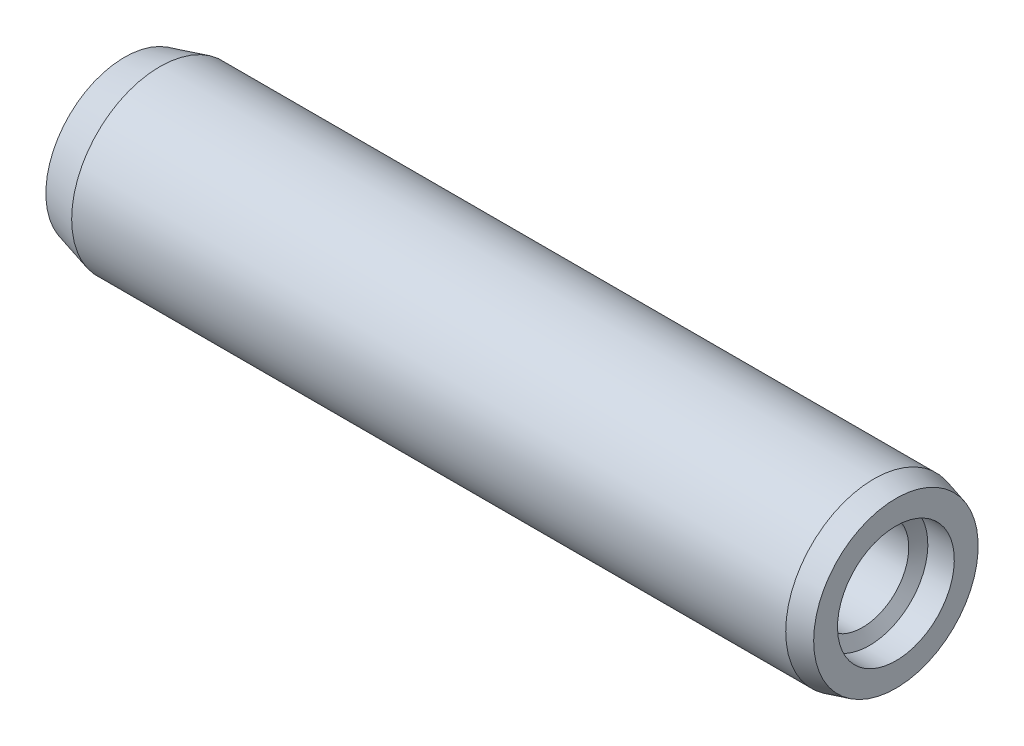
ISO-10303-21;
HEADER;
FILE_DESCRIPTION(('STEP AP214'),'2;1');
FILE_NAME('part.step','',(''),(''),'','','');
FILE_SCHEMA(('AUTOMOTIVE_DESIGN { 1 0 10303 214 1 1 1 1 }'));
ENDSEC;
DATA;
#1=APPLICATION_CONTEXT('core data for automotive mechanical design processes');
#2=APPLICATION_PROTOCOL_DEFINITION('international standard','automotive_design',2000,#1);
#3=PRODUCT_CONTEXT('',#1,'mechanical');
#4=PRODUCT('Part','Part','',(#3));
#5=PRODUCT_RELATED_PRODUCT_CATEGORY('part','',(#4));
#6=PRODUCT_DEFINITION_FORMATION('','',#4);
#7=PRODUCT_DEFINITION_CONTEXT('part definition',#1,'design');
#8=PRODUCT_DEFINITION('design','',#6,#7);
#9=PRODUCT_DEFINITION_SHAPE('','',#8);
#10=(LENGTH_UNIT() NAMED_UNIT(*) SI_UNIT(.MILLI.,.METRE.));
#11=(NAMED_UNIT(*) PLANE_ANGLE_UNIT() SI_UNIT($,.RADIAN.));
#12=(NAMED_UNIT(*) SI_UNIT($,.STERADIAN.) SOLID_ANGLE_UNIT());
#13=UNCERTAINTY_MEASURE_WITH_UNIT(LENGTH_MEASURE(1.E-05),#10,'distance_accuracy_value','');
#14=(GEOMETRIC_REPRESENTATION_CONTEXT(3) GLOBAL_UNCERTAINTY_ASSIGNED_CONTEXT((#13)) GLOBAL_UNIT_ASSIGNED_CONTEXT((#10,
#11,#12)) REPRESENTATION_CONTEXT('',''));
#15=CARTESIAN_POINT('',(0.,0.,0.));
#16=DIRECTION('',(0.,0.,1.));
#17=DIRECTION('',(1.,0.,0.));
#18=AXIS2_PLACEMENT_3D('',#15,#16,#17);
#19=CARTESIAN_POINT('',(23.0000000000814,0.,0.));
#20=DIRECTION('',(1.,0.,0.));
#21=DIRECTION('',(0.,0.,-1.));
#22=AXIS2_PLACEMENT_3D('',#19,#20,#21);
#23=CONICAL_SURFACE('',#22,2.09999999998445,1.04719755120229);
#24=CARTESIAN_POINT('',(21.7875644348169,0.,0.));
#25=VERTEX_POINT('',#24);
#26=VERTEX_LOOP('',#25);
#27=FACE_BOUND('',#26,.T.);
#28=CARTESIAN_POINT('',(23.,0.,0.));
#29=DIRECTION('',(1.,0.,0.));
#30=DIRECTION('',(0.,1.,0.));
#31=AXIS2_PLACEMENT_3D('',#28,#29,#30);
#32=CIRCLE('',#31,2.1);
#33=CARTESIAN_POINT('',(23.,2.1,0.));
#34=VERTEX_POINT('',#33);
#35=EDGE_CURVE('E34',#34,#34,#32,.T.);
#36=ORIENTED_EDGE('',*,*,#35,.T.);
#37=EDGE_LOOP('',(#36));
#38=FACE_BOUND('',#37,.T.);
#39=ADVANCED_FACE('F18',(#27,#38),#23,.F.);
#40=CARTESIAN_POINT('',(35.,0.,0.));
#41=DIRECTION('',(1.,0.,0.));
#42=DIRECTION('',(0.,1.,0.));
#43=AXIS2_PLACEMENT_3D('',#40,#41,#42);
#44=CYLINDRICAL_SURFACE('',#43,2.1);
#45=CARTESIAN_POINT('',(33.4824573519086,0.,0.));
#46=DIRECTION('',(1.,0.,0.));
#47=DIRECTION('',(0.,1.,0.));
#48=AXIS2_PLACEMENT_3D('',#45,#46,#47);
#49=CIRCLE('',#48,2.09999999998445);
#50=CARTESIAN_POINT('',(33.4824573519086,2.09999999998445,0.));
#51=VERTEX_POINT('',#50);
#52=EDGE_CURVE('E36',#51,#51,#49,.T.);
#53=ORIENTED_EDGE('',*,*,#52,.T.);
#54=EDGE_LOOP('',(#53));
#55=FACE_BOUND('',#54,.T.);
#56=ORIENTED_EDGE('',*,*,#35,.F.);
#57=EDGE_LOOP('',(#56));
#58=FACE_BOUND('',#57,.T.);
#59=ADVANCED_FACE('F31',(#55,#58),#44,.F.);
#60=CARTESIAN_POINT('',(33.7999999999283,0.,0.));
#61=DIRECTION('',(1.,0.,0.));
#62=DIRECTION('',(0.,0.,-1.));
#63=AXIS2_PLACEMENT_3D('',#60,#61,#62);
#64=CONICAL_SURFACE('',#63,2.64999999990323,1.04719755119175);
#65=CARTESIAN_POINT('',(33.8,0.,0.));
#66=DIRECTION('',(1.,0.,0.));
#67=DIRECTION('',(0.,1.,0.));
#68=AXIS2_PLACEMENT_3D('',#65,#66,#67);
#69=CIRCLE('',#68,2.65);
#70=CARTESIAN_POINT('',(33.8,2.65,0.));
#71=VERTEX_POINT('',#70);
#72=EDGE_CURVE('E39',#71,#71,#69,.T.);
#73=ORIENTED_EDGE('',*,*,#72,.T.);
#74=EDGE_LOOP('',(#73));
#75=FACE_BOUND('',#74,.T.);
#76=ORIENTED_EDGE('',*,*,#52,.F.);
#77=EDGE_LOOP('',(#76));
#78=FACE_BOUND('',#77,.T.);
#79=ADVANCED_FACE('F122',(#75,#78),#64,.F.);
#80=CARTESIAN_POINT('',(35.,0.,0.));
#81=DIRECTION('',(1.,0.,0.));
#82=DIRECTION('',(0.,1.,0.));
#83=AXIS2_PLACEMENT_3D('',#80,#81,#82);
#84=CYLINDRICAL_SURFACE('',#83,2.65);
#85=CARTESIAN_POINT('',(35.,0.,0.));
#86=DIRECTION('',(1.,0.,0.));
#87=DIRECTION('',(0.,1.,0.));
#88=AXIS2_PLACEMENT_3D('',#85,#86,#87);
#89=CIRCLE('',#88,2.65);
#90=CARTESIAN_POINT('',(35.,2.65,0.));
#91=VERTEX_POINT('',#90);
#92=EDGE_CURVE('E21',#91,#91,#89,.F.);
#93=ORIENTED_EDGE('',*,*,#92,.F.);
#94=EDGE_LOOP('',(#93));
#95=FACE_BOUND('',#94,.T.);
#96=ORIENTED_EDGE('',*,*,#72,.F.);
#97=EDGE_LOOP('',(#96));
#98=FACE_BOUND('',#97,.T.);
#99=ADVANCED_FACE('F112',(#95,#98),#84,.F.);
#100=CARTESIAN_POINT('',(0.,0.,0.));
#101=DIRECTION('',(-1.,0.,0.));
#102=DIRECTION('',(0.,0.,1.));
#103=AXIS2_PLACEMENT_3D('',#100,#101,#102);
#104=PLANE('',#103);
#105=CARTESIAN_POINT('',(0.,0.,0.));
#106=DIRECTION('',(1.,0.,0.));
#107=DIRECTION('',(0.,0.,-1.));
#108=AXIS2_PLACEMENT_3D('',#105,#106,#107);
#109=CIRCLE('',#108,3.5712812921247);
#110=CARTESIAN_POINT('',(0.,0.,-3.5712812921247));
#111=VERTEX_POINT('',#110);
#112=EDGE_CURVE('E45',#111,#111,#109,.T.);
#113=ORIENTED_EDGE('',*,*,#112,.F.);
#114=EDGE_LOOP('',(#113));
#115=FACE_BOUND('',#114,.T.);
#116=ADVANCED_FACE('F73',(#115),#104,.T.);
#117=CARTESIAN_POINT('',(35.,3.73205080756888,0.));
#118=DIRECTION('',(1.,0.,0.));
#119=DIRECTION('',(0.,0.,-1.));
#120=AXIS2_PLACEMENT_3D('',#117,#118,#119);
#121=PLANE('',#120);
#122=CARTESIAN_POINT('',(34.9999999999682,0.,0.));
#123=DIRECTION('',(-1.,0.,0.));
#124=DIRECTION('',(0.,0.,1.));
#125=AXIS2_PLACEMENT_3D('',#122,#123,#124);
#126=CIRCLE('',#125,3.73205080759931);
#127=CARTESIAN_POINT('',(34.9999999999682,0.,3.73205080759931));
#128=VERTEX_POINT('',#127);
#129=EDGE_CURVE('E43',#128,#128,#126,.T.);
#130=ORIENTED_EDGE('',*,*,#129,.F.);
#131=EDGE_LOOP('',(#130));
#132=FACE_BOUND('',#131,.T.);
#133=ORIENTED_EDGE('',*,*,#92,.T.);
#134=EDGE_LOOP('',(#133));
#135=FACE_BOUND('',#134,.T.);
#136=ADVANCED_FACE('F64',(#132,#135),#121,.T.);
#137=CARTESIAN_POINT('',(1.60000000005311,0.,0.));
#138=DIRECTION('',(1.,0.,0.));
#139=DIRECTION('',(0.,0.,-1.));
#140=AXIS2_PLACEMENT_3D('',#137,#138,#139);
#141=CONICAL_SURFACE('',#140,4.0000000000191,0.261799387793537);
#142=CARTESIAN_POINT('',(1.6,0.,0.));
#143=DIRECTION('',(1.,0.,0.));
#144=DIRECTION('',(0.,0.,-1.));
#145=AXIS2_PLACEMENT_3D('',#142,#143,#144);
#146=CIRCLE('',#145,4.);
#147=CARTESIAN_POINT('',(1.6,0.,-4.));
#148=VERTEX_POINT('',#147);
#149=EDGE_CURVE('E25',#148,#148,#146,.T.);
#150=ORIENTED_EDGE('',*,*,#149,.F.);
#151=EDGE_LOOP('',(#150));
#152=FACE_BOUND('',#151,.T.);
#153=ORIENTED_EDGE('',*,*,#112,.T.);
#154=EDGE_LOOP('',(#153));
#155=FACE_BOUND('',#154,.T.);
#156=ADVANCED_FACE('F61',(#152,#155),#141,.T.);
#157=CARTESIAN_POINT('',(34.0000000000487,0.,0.));
#158=DIRECTION('',(-1.,0.,0.));
#159=DIRECTION('',(0.,0.,1.));
#160=AXIS2_PLACEMENT_3D('',#157,#158,#159);
#161=CONICAL_SURFACE('',#160,4.0000000000191,0.2617993878087);
#162=CARTESIAN_POINT('',(34.,0.,0.));
#163=DIRECTION('',(1.,0.,0.));
#164=DIRECTION('',(0.,0.,-1.));
#165=AXIS2_PLACEMENT_3D('',#162,#163,#164);
#166=CIRCLE('',#165,4.);
#167=CARTESIAN_POINT('',(34.,0.,-4.));
#168=VERTEX_POINT('',#167);
#169=EDGE_CURVE('E11',#168,#168,#166,.F.);
#170=ORIENTED_EDGE('',*,*,#169,.F.);
#171=EDGE_LOOP('',(#170));
#172=FACE_BOUND('',#171,.T.);
#173=ORIENTED_EDGE('',*,*,#129,.T.);
#174=EDGE_LOOP('',(#173));
#175=FACE_BOUND('',#174,.T.);
#176=ADVANCED_FACE('F63',(#172,#175),#161,.T.);
#177=CARTESIAN_POINT('',(0.,0.,0.));
#178=DIRECTION('',(1.,0.,0.));
#179=DIRECTION('',(0.,0.,-1.));
#180=AXIS2_PLACEMENT_3D('',#177,#178,#179);
#181=CYLINDRICAL_SURFACE('',#180,4.);
#182=ORIENTED_EDGE('',*,*,#169,.T.);
#183=EDGE_LOOP('',(#182));
#184=FACE_BOUND('',#183,.T.);
#185=ORIENTED_EDGE('',*,*,#149,.T.);
#186=EDGE_LOOP('',(#185));
#187=FACE_BOUND('',#186,.T.);
#188=ADVANCED_FACE('F59',(#184,#187),#181,.T.);
#189=CLOSED_SHELL('',(#39,#59,#79,#99,#116,#136,#156,#176,#188));
#190=MANIFOLD_SOLID_BREP('B1',#189);
#191=ADVANCED_BREP_SHAPE_REPRESENTATION('',(#18,#190),#14);
#192=SHAPE_DEFINITION_REPRESENTATION(#9,#191);
ENDSEC;
END-ISO-10303-21;
